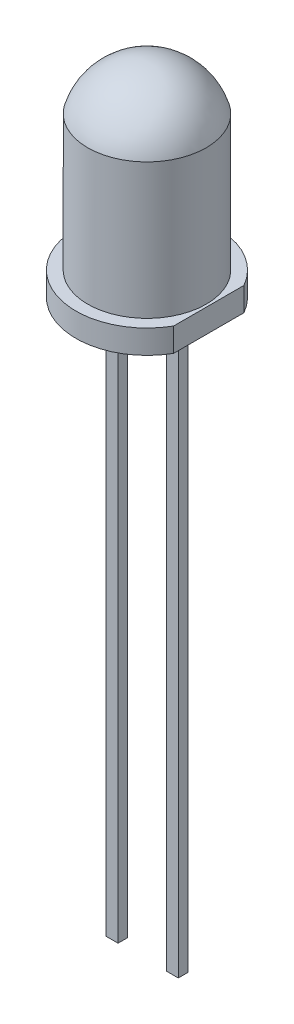
ISO-10303-21;
HEADER;
FILE_DESCRIPTION(('STEP AP214'),'2;1');
FILE_NAME('part.step','',(''),(''),'','','');
FILE_SCHEMA(('AUTOMOTIVE_DESIGN { 1 0 10303 214 1 1 1 1 }'));
ENDSEC;
DATA;
#1=APPLICATION_CONTEXT('core data for automotive mechanical design processes');
#2=APPLICATION_PROTOCOL_DEFINITION('international standard','automotive_design',2000,#1);
#3=PRODUCT_CONTEXT('',#1,'mechanical');
#4=PRODUCT('Part','Part','',(#3));
#5=PRODUCT_RELATED_PRODUCT_CATEGORY('part','',(#4));
#6=PRODUCT_DEFINITION_FORMATION('','',#4);
#7=PRODUCT_DEFINITION_CONTEXT('part definition',#1,'design');
#8=PRODUCT_DEFINITION('design','',#6,#7);
#9=PRODUCT_DEFINITION_SHAPE('','',#8);
#10=(LENGTH_UNIT() NAMED_UNIT(*) SI_UNIT(.MILLI.,.METRE.));
#11=(NAMED_UNIT(*) PLANE_ANGLE_UNIT() SI_UNIT($,.RADIAN.));
#12=(NAMED_UNIT(*) SI_UNIT($,.STERADIAN.) SOLID_ANGLE_UNIT());
#13=UNCERTAINTY_MEASURE_WITH_UNIT(LENGTH_MEASURE(1.E-05),#10,'distance_accuracy_value','');
#14=(GEOMETRIC_REPRESENTATION_CONTEXT(3) GLOBAL_UNCERTAINTY_ASSIGNED_CONTEXT((#13)) GLOBAL_UNIT_ASSIGNED_CONTEXT((#10,
#11,#12)) REPRESENTATION_CONTEXT('',''));
#15=CARTESIAN_POINT('',(0.,0.,0.));
#16=DIRECTION('',(0.,0.,1.));
#17=DIRECTION('',(1.,0.,0.));
#18=AXIS2_PLACEMENT_3D('',#15,#16,#17);
#19=CARTESIAN_POINT('',(0.,-1.00000000000015,0.));
#20=DIRECTION('',(0.,-1.00000000000001,0.));
#21=DIRECTION('',(1.,0.,0.));
#22=AXIS2_PLACEMENT_3D('',#19,#20,#21);
#23=PLANE('',#22);
#24=DIRECTION('',(1.,0.,0.));
#25=VECTOR('',#24,1.);
#26=CARTESIAN_POINT('',(1.52000000000001,-1.00000000000015,-0.19999999999998));
#27=LINE('',#26,#25);
#28=CARTESIAN_POINT('',(1.01999999999999,-1.00000000000015,-0.19999999999998));
#29=VERTEX_POINT('',#28);
#30=CARTESIAN_POINT('',(1.52000000000001,-1.00000000000015,-0.19999999999998));
#31=VERTEX_POINT('',#30);
#32=EDGE_CURVE('E152',#29,#31,#27,.T.);
#33=ORIENTED_EDGE('',*,*,#32,.F.);
#34=DIRECTION('',(0.,0.,-1.00000000000001));
#35=VECTOR('',#34,1.);
#36=CARTESIAN_POINT('',(1.02000000000001,-1.0000000000001,0.200000000000019));
#37=LINE('',#36,#35);
#38=CARTESIAN_POINT('',(1.02000000000001,-1.0000000000001,0.200000000000019));
#39=VERTEX_POINT('',#38);
#40=EDGE_CURVE('E149',#39,#29,#37,.T.);
#41=ORIENTED_EDGE('',*,*,#40,.F.);
#42=DIRECTION('',(-1.,0.,0.));
#43=VECTOR('',#42,1.);
#44=CARTESIAN_POINT('',(1.52,-0.999999999999959,0.200000000000027));
#45=LINE('',#44,#43);
#46=CARTESIAN_POINT('',(1.52,-0.999999999999959,0.200000000000027));
#47=VERTEX_POINT('',#46);
#48=EDGE_CURVE('E161',#47,#39,#45,.T.);
#49=ORIENTED_EDGE('',*,*,#48,.F.);
#50=DIRECTION('',(0.,0.,1.00000000000001));
#51=VECTOR('',#50,1.);
#52=CARTESIAN_POINT('',(1.52,-0.999999999999959,0.200000000000027));
#53=LINE('',#52,#51);
#54=EDGE_CURVE('E169',#31,#47,#53,.T.);
#55=ORIENTED_EDGE('',*,*,#54,.F.);
#56=EDGE_LOOP('',(#33,#41,#49,#55));
#57=FACE_BOUND('',#56,.T.);
#58=CARTESIAN_POINT('',(0.,-1.00000000000015,0.));
#59=DIRECTION('',(0.,-1.00000000000001,0.));
#60=DIRECTION('',(1.,0.,0.));
#61=AXIS2_PLACEMENT_3D('',#58,#59,#60);
#62=CIRCLE('',#61,3.);
#63=CARTESIAN_POINT('',(2.60753942796298,-0.999999999999959,1.48348850066947));
#64=VERTEX_POINT('',#63);
#65=CARTESIAN_POINT('',(2.60753942796298,-1.00000000000008,-1.48348850066942));
#66=VERTEX_POINT('',#65);
#67=EDGE_CURVE('E181',#64,#66,#62,.T.);
#68=ORIENTED_EDGE('',*,*,#67,.T.);
#69=DIRECTION('',(0.,0.,1.00000000000001));
#70=VECTOR('',#69,1.);
#71=CARTESIAN_POINT('',(2.60753942796298,-0.999999999999959,1.48348850066947));
#72=LINE('',#71,#70);
#73=EDGE_CURVE('E184',#66,#64,#72,.T.);
#74=ORIENTED_EDGE('',*,*,#73,.T.);
#75=EDGE_LOOP('',(#68,#74));
#76=FACE_BOUND('',#75,.T.);
#77=DIRECTION('',(1.,0.,0.));
#78=VECTOR('',#77,1.);
#79=CARTESIAN_POINT('',(-1.52,-1.00000000000015,-0.199999999999984));
#80=LINE('',#79,#78);
#81=CARTESIAN_POINT('',(-1.52,-1.00000000000015,-0.199999999999984));
#82=VERTEX_POINT('',#81);
#83=CARTESIAN_POINT('',(-1.02000000000001,-1.00000000000018,-0.199999999999983));
#84=VERTEX_POINT('',#83);
#85=EDGE_CURVE('E237',#82,#84,#80,.T.);
#86=ORIENTED_EDGE('',*,*,#85,.F.);
#87=DIRECTION('',(0.,0.,-1.00000000000001));
#88=VECTOR('',#87,1.);
#89=CARTESIAN_POINT('',(-1.51999999999999,-1.00000000000018,0.200000000000017));
#90=LINE('',#89,#88);
#91=CARTESIAN_POINT('',(-1.51999999999999,-1.00000000000018,0.200000000000017));
#92=VERTEX_POINT('',#91);
#93=EDGE_CURVE('E147',#92,#82,#90,.T.);
#94=ORIENTED_EDGE('',*,*,#93,.F.);
#95=DIRECTION('',(-1.,0.,0.));
#96=VECTOR('',#95,1.);
#97=CARTESIAN_POINT('',(-1.51999999999999,-1.00000000000018,0.200000000000017));
#98=LINE('',#97,#96);
#99=CARTESIAN_POINT('',(-1.02000000000001,-1.00000000000022,0.200000000000019));
#100=VERTEX_POINT('',#99);
#101=EDGE_CURVE('E143',#100,#92,#98,.T.);
#102=ORIENTED_EDGE('',*,*,#101,.F.);
#103=DIRECTION('',(0.,0.,1.00000000000001));
#104=VECTOR('',#103,1.);
#105=CARTESIAN_POINT('',(-1.02000000000001,-1.00000000000022,0.200000000000019));
#106=LINE('',#105,#104);
#107=EDGE_CURVE('E239',#84,#100,#106,.T.);
#108=ORIENTED_EDGE('',*,*,#107,.F.);
#109=EDGE_LOOP('',(#86,#94,#102,#108));
#110=FACE_BOUND('',#109,.T.);
#111=ADVANCED_FACE('F46',(#57,#76,#110),#23,.T.);
#112=CARTESIAN_POINT('',(0.,4.99999999999985,0.));
#113=DIRECTION('',(0.,1.00000000000001,0.));
#114=DIRECTION('',(1.,0.,0.));
#115=AXIS2_PLACEMENT_3D('',#112,#113,#114);
#116=SPHERICAL_SURFACE('',#115,2.6);
#117=CARTESIAN_POINT('',(0.,5.71414284285423,0.));
#118=DIRECTION('',(0.,1.00000000000001,0.));
#119=DIRECTION('',(-1.,0.,0.));
#120=AXIS2_PLACEMENT_3D('',#117,#118,#119);
#121=CIRCLE('',#120,2.5);
#122=CARTESIAN_POINT('',(-2.50000000000002,5.71414284285423,0.));
#123=VERTEX_POINT('',#122);
#124=EDGE_CURVE('E13',#123,#123,#121,.T.);
#125=ORIENTED_EDGE('',*,*,#124,.T.);
#126=EDGE_LOOP('',(#125));
#127=FACE_BOUND('',#126,.T.);
#128=ADVANCED_FACE('F48',(#127),#116,.T.);
#129=CARTESIAN_POINT('',(0.,7.60000000000012,0.));
#130=DIRECTION('',(0.,1.00000000000001,0.));
#131=DIRECTION('',(-1.,0.,0.));
#132=AXIS2_PLACEMENT_3D('',#129,#130,#131);
#133=CYLINDRICAL_SURFACE('',#132,2.5);
#134=ORIENTED_EDGE('',*,*,#124,.F.);
#135=EDGE_LOOP('',(#134));
#136=FACE_BOUND('',#135,.T.);
#137=CARTESIAN_POINT('',(0.,0.,0.));
#138=DIRECTION('',(0.,-1.00000000000001,0.));
#139=DIRECTION('',(1.,0.,0.));
#140=AXIS2_PLACEMENT_3D('',#137,#138,#139);
#141=CIRCLE('',#140,2.5);
#142=CARTESIAN_POINT('',(2.5,0.,0.));
#143=VERTEX_POINT('',#142);
#144=EDGE_CURVE('E54',#143,#143,#141,.T.);
#145=ORIENTED_EDGE('',*,*,#144,.F.);
#146=EDGE_LOOP('',(#145));
#147=FACE_BOUND('',#146,.T.);
#148=ADVANCED_FACE('F200',(#136,#147),#133,.T.);
#149=CARTESIAN_POINT('',(0.,0.,0.));
#150=DIRECTION('',(0.,-1.00000000000001,0.));
#151=DIRECTION('',(1.,0.,0.));
#152=AXIS2_PLACEMENT_3D('',#149,#150,#151);
#153=PLANE('',#152);
#154=CARTESIAN_POINT('',(0.,0.,0.));
#155=DIRECTION('',(0.,-1.00000000000001,0.));
#156=DIRECTION('',(1.,0.,0.));
#157=AXIS2_PLACEMENT_3D('',#154,#155,#156);
#158=CIRCLE('',#157,3.);
#159=CARTESIAN_POINT('',(2.607539427963,-1.52655665885959E-13,1.48348850066947));
#160=VERTEX_POINT('',#159);
#161=CARTESIAN_POINT('',(2.60753942796298,-1.17961196366423E-13,-1.48348850066943));
#162=VERTEX_POINT('',#161);
#163=EDGE_CURVE('E180',#160,#162,#158,.T.);
#164=ORIENTED_EDGE('',*,*,#163,.F.);
#165=DIRECTION('',(0.,0.,1.00000000000001));
#166=VECTOR('',#165,1.);
#167=CARTESIAN_POINT('',(2.607539427963,-1.52655665885959E-13,1.48348850066947));
#168=LINE('',#167,#166);
#169=EDGE_CURVE('E185',#162,#160,#168,.T.);
#170=ORIENTED_EDGE('',*,*,#169,.F.);
#171=EDGE_LOOP('',(#164,#170));
#172=FACE_BOUND('',#171,.T.);
#173=ORIENTED_EDGE('',*,*,#144,.T.);
#174=EDGE_LOOP('',(#173));
#175=FACE_BOUND('',#174,.T.);
#176=ADVANCED_FACE('F198',(#172,#175),#153,.F.);
#177=CARTESIAN_POINT('',(0.,-1.00000000000015,0.));
#178=DIRECTION('',(0.,1.00000000000001,0.));
#179=DIRECTION('',(-1.,0.,0.));
#180=AXIS2_PLACEMENT_3D('',#177,#178,#179);
#181=CYLINDRICAL_SURFACE('',#180,3.);
#182=ORIENTED_EDGE('',*,*,#163,.T.);
#183=DIRECTION('',(0.,1.00000000000001,0.));
#184=VECTOR('',#183,1.);
#185=CARTESIAN_POINT('',(2.60753942796298,-1.00000000000008,-1.48348850066942));
#186=LINE('',#185,#184);
#187=EDGE_CURVE('E193',#66,#162,#186,.T.);
#188=ORIENTED_EDGE('',*,*,#187,.F.);
#189=ORIENTED_EDGE('',*,*,#67,.F.);
#190=DIRECTION('',(0.,1.00000000000001,0.));
#191=VECTOR('',#190,1.);
#192=CARTESIAN_POINT('',(2.60753942796298,-0.999999999999959,1.48348850066947));
#193=LINE('',#192,#191);
#194=EDGE_CURVE('E187',#64,#160,#193,.T.);
#195=ORIENTED_EDGE('',*,*,#194,.T.);
#196=EDGE_LOOP('',(#182,#188,#189,#195));
#197=FACE_BOUND('',#196,.T.);
#198=ADVANCED_FACE('F207',(#197),#181,.T.);
#199=CARTESIAN_POINT('',(2.60753942796298,-0.999999999999959,1.48348850066947));
#200=DIRECTION('',(-1.,0.,0.));
#201=DIRECTION('',(0.,-1.00000000000001,0.));
#202=AXIS2_PLACEMENT_3D('',#199,#200,#201);
#203=PLANE('',#202);
#204=ORIENTED_EDGE('',*,*,#169,.T.);
#205=ORIENTED_EDGE('',*,*,#194,.F.);
#206=ORIENTED_EDGE('',*,*,#73,.F.);
#207=ORIENTED_EDGE('',*,*,#187,.T.);
#208=EDGE_LOOP('',(#204,#205,#206,#207));
#209=FACE_BOUND('',#208,.T.);
#210=ADVANCED_FACE('F224',(#209),#203,.F.);
#211=CARTESIAN_POINT('',(1.01999999999999,-25.0000000000003,0.200000000000021));
#212=DIRECTION('',(1.,0.,0.));
#213=DIRECTION('',(0.,1.00000000000001,0.));
#214=AXIS2_PLACEMENT_3D('',#211,#212,#213);
#215=PLANE('',#214);
#216=ORIENTED_EDGE('',*,*,#40,.T.);
#217=DIRECTION('',(0.,1.00000000000001,0.));
#218=VECTOR('',#217,1.);
#219=CARTESIAN_POINT('',(1.01999999999998,-25.0000000000002,-0.199999999999981));
#220=LINE('',#219,#218);
#221=CARTESIAN_POINT('',(1.01999999999998,-25.0000000000002,-0.199999999999981));
#222=VERTEX_POINT('',#221);
#223=EDGE_CURVE('E178',#222,#29,#220,.T.);
#224=ORIENTED_EDGE('',*,*,#223,.F.);
#225=DIRECTION('',(0.,0.,-1.00000000000001));
#226=VECTOR('',#225,1.);
#227=CARTESIAN_POINT('',(1.01999999999999,-25.0000000000003,0.200000000000021));
#228=LINE('',#227,#226);
#229=CARTESIAN_POINT('',(1.01999999999999,-25.0000000000003,0.200000000000021));
#230=VERTEX_POINT('',#229);
#231=EDGE_CURVE('E157',#230,#222,#228,.T.);
#232=ORIENTED_EDGE('',*,*,#231,.F.);
#233=DIRECTION('',(0.,1.00000000000001,0.));
#234=VECTOR('',#233,1.);
#235=CARTESIAN_POINT('',(1.01999999999999,-25.0000000000003,0.200000000000021));
#236=LINE('',#235,#234);
#237=EDGE_CURVE('E166',#230,#39,#236,.T.);
#238=ORIENTED_EDGE('',*,*,#237,.T.);
#239=EDGE_LOOP('',(#216,#224,#232,#238));
#240=FACE_BOUND('',#239,.T.);
#241=ADVANCED_FACE('F221',(#240),#215,.F.);
#242=CARTESIAN_POINT('',(1.51999999999999,-25.,-0.199999999999978));
#243=DIRECTION('',(0.,0.,1.00000000000001));
#244=DIRECTION('',(1.,0.,0.));
#245=AXIS2_PLACEMENT_3D('',#242,#243,#244);
#246=PLANE('',#245);
#247=ORIENTED_EDGE('',*,*,#32,.T.);
#248=DIRECTION('',(0.,1.00000000000001,0.));
#249=VECTOR('',#248,1.);
#250=CARTESIAN_POINT('',(1.51999999999999,-25.,-0.199999999999978));
#251=LINE('',#250,#249);
#252=CARTESIAN_POINT('',(1.51999999999999,-25.,-0.199999999999978));
#253=VERTEX_POINT('',#252);
#254=EDGE_CURVE('E175',#253,#31,#251,.T.);
#255=ORIENTED_EDGE('',*,*,#254,.F.);
#256=DIRECTION('',(1.,0.,0.));
#257=VECTOR('',#256,1.);
#258=CARTESIAN_POINT('',(1.51999999999999,-25.,-0.199999999999978));
#259=LINE('',#258,#257);
#260=EDGE_CURVE('E160',#222,#253,#259,.T.);
#261=ORIENTED_EDGE('',*,*,#260,.F.);
#262=ORIENTED_EDGE('',*,*,#223,.T.);
#263=EDGE_LOOP('',(#247,#255,#261,#262));
#264=FACE_BOUND('',#263,.T.);
#265=ADVANCED_FACE('F273',(#264),#246,.F.);
#266=CARTESIAN_POINT('',(1.51999999999998,-25.0000000000001,0.200000000000021));
#267=DIRECTION('',(-1.,0.,0.));
#268=DIRECTION('',(0.,-1.00000000000001,0.));
#269=AXIS2_PLACEMENT_3D('',#266,#267,#268);
#270=PLANE('',#269);
#271=ORIENTED_EDGE('',*,*,#54,.T.);
#272=DIRECTION('',(0.,1.00000000000001,0.));
#273=VECTOR('',#272,1.);
#274=CARTESIAN_POINT('',(1.51999999999998,-25.0000000000001,0.200000000000021));
#275=LINE('',#274,#273);
#276=CARTESIAN_POINT('',(1.51999999999998,-25.0000000000001,0.200000000000021));
#277=VERTEX_POINT('',#276);
#278=EDGE_CURVE('E69',#277,#47,#275,.T.);
#279=ORIENTED_EDGE('',*,*,#278,.F.);
#280=DIRECTION('',(0.,0.,1.00000000000001));
#281=VECTOR('',#280,1.);
#282=CARTESIAN_POINT('',(1.51999999999998,-25.0000000000001,0.200000000000021));
#283=LINE('',#282,#281);
#284=EDGE_CURVE('E163',#253,#277,#283,.T.);
#285=ORIENTED_EDGE('',*,*,#284,.F.);
#286=ORIENTED_EDGE('',*,*,#254,.T.);
#287=EDGE_LOOP('',(#271,#279,#285,#286));
#288=FACE_BOUND('',#287,.T.);
#289=ADVANCED_FACE('F271',(#288),#270,.F.);
#290=CARTESIAN_POINT('',(1.51999999999998,-25.0000000000001,0.200000000000021));
#291=DIRECTION('',(0.,0.,-1.00000000000001));
#292=DIRECTION('',(-1.,0.,0.));
#293=AXIS2_PLACEMENT_3D('',#290,#291,#292);
#294=PLANE('',#293);
#295=ORIENTED_EDGE('',*,*,#48,.T.);
#296=ORIENTED_EDGE('',*,*,#237,.F.);
#297=DIRECTION('',(-1.,0.,0.));
#298=VECTOR('',#297,1.);
#299=CARTESIAN_POINT('',(1.51999999999998,-25.0000000000001,0.200000000000021));
#300=LINE('',#299,#298);
#301=EDGE_CURVE('E165',#277,#230,#300,.T.);
#302=ORIENTED_EDGE('',*,*,#301,.F.);
#303=ORIENTED_EDGE('',*,*,#278,.T.);
#304=EDGE_LOOP('',(#295,#296,#302,#303));
#305=FACE_BOUND('',#304,.T.);
#306=ADVANCED_FACE('F267',(#305),#294,.F.);
#307=CARTESIAN_POINT('',(1.01999999999998,-25.0000000000002,-0.199999999999981));
#308=DIRECTION('',(0.,1.00000000000001,0.));
#309=DIRECTION('',(-1.,0.,0.));
#310=AXIS2_PLACEMENT_3D('',#307,#308,#309);
#311=PLANE('',#310);
#312=ORIENTED_EDGE('',*,*,#231,.T.);
#313=ORIENTED_EDGE('',*,*,#260,.T.);
#314=ORIENTED_EDGE('',*,*,#284,.T.);
#315=ORIENTED_EDGE('',*,*,#301,.T.);
#316=EDGE_LOOP('',(#312,#313,#314,#315));
#317=FACE_BOUND('',#316,.T.);
#318=ADVANCED_FACE('F264',(#317),#311,.F.);
#319=CARTESIAN_POINT('',(-1.52000000000003,-25.0000000000003,0.200000000000025));
#320=DIRECTION('',(1.,0.,0.));
#321=DIRECTION('',(0.,1.00000000000001,0.));
#322=AXIS2_PLACEMENT_3D('',#319,#320,#321);
#323=PLANE('',#322);
#324=ORIENTED_EDGE('',*,*,#93,.T.);
#325=DIRECTION('',(0.,1.00000000000001,0.));
#326=VECTOR('',#325,1.);
#327=CARTESIAN_POINT('',(-1.52000000000002,-25.0000000000003,-0.199999999999981));
#328=LINE('',#327,#326);
#329=CARTESIAN_POINT('',(-1.52000000000002,-25.0000000000003,-0.199999999999981));
#330=VERTEX_POINT('',#329);
#331=EDGE_CURVE('E128',#330,#82,#328,.T.);
#332=ORIENTED_EDGE('',*,*,#331,.F.);
#333=DIRECTION('',(0.,0.,-1.00000000000001));
#334=VECTOR('',#333,1.);
#335=CARTESIAN_POINT('',(-1.52000000000003,-25.0000000000003,0.200000000000025));
#336=LINE('',#335,#334);
#337=CARTESIAN_POINT('',(-1.52000000000003,-25.0000000000003,0.200000000000025));
#338=VERTEX_POINT('',#337);
#339=EDGE_CURVE('E135',#338,#330,#336,.T.);
#340=ORIENTED_EDGE('',*,*,#339,.F.);
#341=DIRECTION('',(0.,1.00000000000001,0.));
#342=VECTOR('',#341,1.);
#343=CARTESIAN_POINT('',(-1.52000000000003,-25.0000000000003,0.200000000000025));
#344=LINE('',#343,#342);
#345=EDGE_CURVE('E246',#338,#92,#344,.T.);
#346=ORIENTED_EDGE('',*,*,#345,.T.);
#347=EDGE_LOOP('',(#324,#332,#340,#346));
#348=FACE_BOUND('',#347,.T.);
#349=ADVANCED_FACE('F145',(#348),#323,.F.);
#350=CARTESIAN_POINT('',(-1.52000000000002,-25.0000000000003,-0.199999999999981));
#351=DIRECTION('',(0.,0.,1.00000000000001));
#352=DIRECTION('',(1.,0.,0.));
#353=AXIS2_PLACEMENT_3D('',#350,#351,#352);
#354=PLANE('',#353);
#355=ORIENTED_EDGE('',*,*,#85,.T.);
#356=DIRECTION('',(0.,1.00000000000001,0.));
#357=VECTOR('',#356,1.);
#358=CARTESIAN_POINT('',(-1.02,-25.0000000000003,-0.199999999999984));
#359=LINE('',#358,#357);
#360=CARTESIAN_POINT('',(-1.02,-25.0000000000003,-0.199999999999984));
#361=VERTEX_POINT('',#360);
#362=EDGE_CURVE('E131',#361,#84,#359,.T.);
#363=ORIENTED_EDGE('',*,*,#362,.F.);
#364=DIRECTION('',(1.,0.,0.));
#365=VECTOR('',#364,1.);
#366=CARTESIAN_POINT('',(-1.52000000000002,-25.0000000000003,-0.199999999999981));
#367=LINE('',#366,#365);
#368=EDGE_CURVE('E124',#330,#361,#367,.T.);
#369=ORIENTED_EDGE('',*,*,#368,.F.);
#370=ORIENTED_EDGE('',*,*,#331,.T.);
#371=EDGE_LOOP('',(#355,#363,#369,#370));
#372=FACE_BOUND('',#371,.T.);
#373=ADVANCED_FACE('F126',(#372),#354,.F.);
#374=CARTESIAN_POINT('',(-1.02,-25.0000000000003,0.200000000000025));
#375=DIRECTION('',(-1.,0.,0.));
#376=DIRECTION('',(0.,-1.00000000000001,0.));
#377=AXIS2_PLACEMENT_3D('',#374,#375,#376);
#378=PLANE('',#377);
#379=ORIENTED_EDGE('',*,*,#107,.T.);
#380=DIRECTION('',(0.,1.00000000000001,0.));
#381=VECTOR('',#380,1.);
#382=CARTESIAN_POINT('',(-1.02,-25.0000000000003,0.200000000000025));
#383=LINE('',#382,#381);
#384=CARTESIAN_POINT('',(-1.02,-25.0000000000003,0.200000000000025));
#385=VERTEX_POINT('',#384);
#386=EDGE_CURVE('E61',#385,#100,#383,.T.);
#387=ORIENTED_EDGE('',*,*,#386,.F.);
#388=DIRECTION('',(0.,0.,1.00000000000001));
#389=VECTOR('',#388,1.);
#390=CARTESIAN_POINT('',(-1.02,-25.0000000000003,0.200000000000025));
#391=LINE('',#390,#389);
#392=EDGE_CURVE('E134',#361,#385,#391,.T.);
#393=ORIENTED_EDGE('',*,*,#392,.F.);
#394=ORIENTED_EDGE('',*,*,#362,.T.);
#395=EDGE_LOOP('',(#379,#387,#393,#394));
#396=FACE_BOUND('',#395,.T.);
#397=ADVANCED_FACE('F249',(#396),#378,.F.);
#398=CARTESIAN_POINT('',(-1.52000000000003,-25.0000000000003,0.200000000000025));
#399=DIRECTION('',(0.,0.,-1.00000000000001));
#400=DIRECTION('',(-1.,0.,0.));
#401=AXIS2_PLACEMENT_3D('',#398,#399,#400);
#402=PLANE('',#401);
#403=ORIENTED_EDGE('',*,*,#101,.T.);
#404=ORIENTED_EDGE('',*,*,#345,.F.);
#405=DIRECTION('',(-1.,0.,0.));
#406=VECTOR('',#405,1.);
#407=CARTESIAN_POINT('',(-1.52000000000003,-25.0000000000003,0.200000000000025));
#408=LINE('',#407,#406);
#409=EDGE_CURVE('E139',#385,#338,#408,.T.);
#410=ORIENTED_EDGE('',*,*,#409,.F.);
#411=ORIENTED_EDGE('',*,*,#386,.T.);
#412=EDGE_LOOP('',(#403,#404,#410,#411));
#413=FACE_BOUND('',#412,.T.);
#414=ADVANCED_FACE('F250',(#413),#402,.F.);
#415=CARTESIAN_POINT('',(-1.52000000000002,-25.0000000000003,-0.199999999999981));
#416=DIRECTION('',(0.,-1.00000000000001,0.));
#417=DIRECTION('',(1.,0.,0.));
#418=AXIS2_PLACEMENT_3D('',#415,#416,#417);
#419=PLANE('',#418);
#420=ORIENTED_EDGE('',*,*,#339,.T.);
#421=ORIENTED_EDGE('',*,*,#368,.T.);
#422=ORIENTED_EDGE('',*,*,#392,.T.);
#423=ORIENTED_EDGE('',*,*,#409,.T.);
#424=EDGE_LOOP('',(#420,#421,#422,#423));
#425=FACE_BOUND('',#424,.T.);
#426=ADVANCED_FACE('F138',(#425),#419,.T.);
#427=CLOSED_SHELL('',(#111,#128,#148,#176,#198,#210,#241,#265,#289,#306,#318,#349,#373,#397,
#414,#426));
#428=MANIFOLD_SOLID_BREP('B2',#427);
#429=ADVANCED_BREP_SHAPE_REPRESENTATION('',(#18,#428),#14);
#430=SHAPE_DEFINITION_REPRESENTATION(#9,#429);
ENDSEC;
END-ISO-10303-21;
